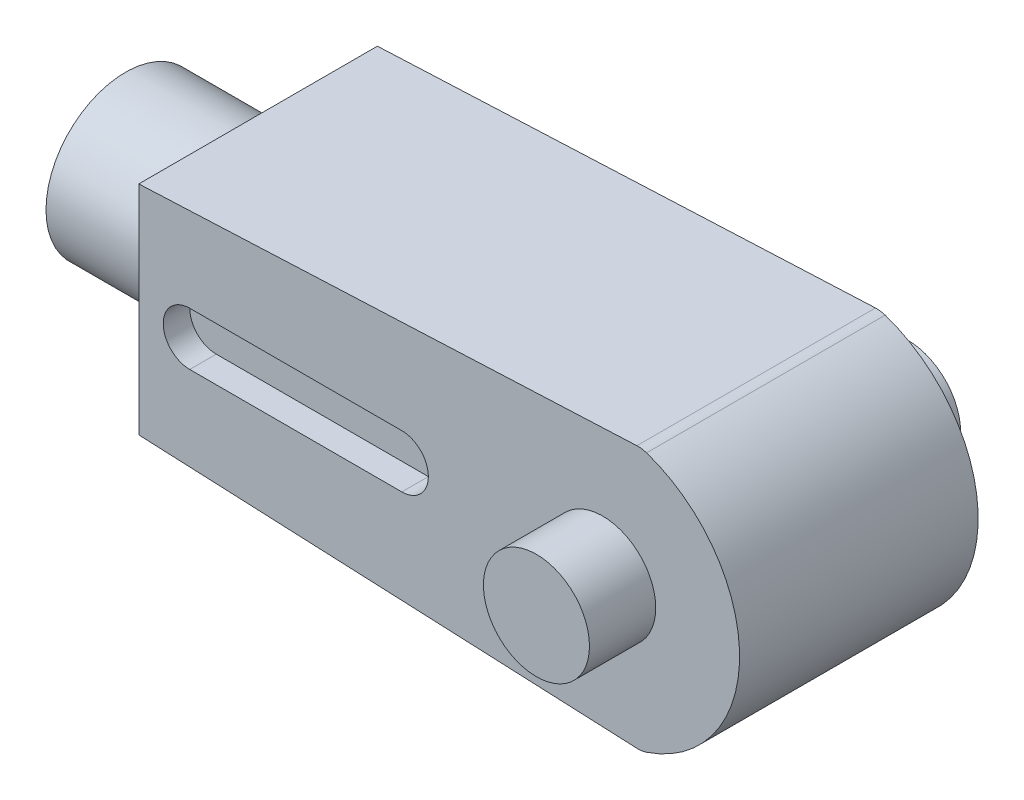
ISO-10303-21;
HEADER;
FILE_DESCRIPTION(('STEP AP214'),'2;1');
FILE_NAME('part.step','',(''),(''),'','','');
FILE_SCHEMA(('AUTOMOTIVE_DESIGN { 1 0 10303 214 1 1 1 1 }'));
ENDSEC;
DATA;
#1=APPLICATION_CONTEXT('core data for automotive mechanical design processes');
#2=APPLICATION_PROTOCOL_DEFINITION('international standard','automotive_design',2000,#1);
#3=PRODUCT_CONTEXT('',#1,'mechanical');
#4=PRODUCT('Part','Part','',(#3));
#5=PRODUCT_RELATED_PRODUCT_CATEGORY('part','',(#4));
#6=PRODUCT_DEFINITION_FORMATION('','',#4);
#7=PRODUCT_DEFINITION_CONTEXT('part definition',#1,'design');
#8=PRODUCT_DEFINITION('design','',#6,#7);
#9=PRODUCT_DEFINITION_SHAPE('','',#8);
#10=(LENGTH_UNIT() NAMED_UNIT(*) SI_UNIT(.MILLI.,.METRE.));
#11=(NAMED_UNIT(*) PLANE_ANGLE_UNIT() SI_UNIT($,.RADIAN.));
#12=(NAMED_UNIT(*) SI_UNIT($,.STERADIAN.) SOLID_ANGLE_UNIT());
#13=UNCERTAINTY_MEASURE_WITH_UNIT(LENGTH_MEASURE(1.E-05),#10,'distance_accuracy_value','');
#14=(GEOMETRIC_REPRESENTATION_CONTEXT(3) GLOBAL_UNCERTAINTY_ASSIGNED_CONTEXT((#13)) GLOBAL_UNIT_ASSIGNED_CONTEXT((#10,
#11,#12)) REPRESENTATION_CONTEXT('',''));
#15=CARTESIAN_POINT('',(0.,0.,0.));
#16=DIRECTION('',(0.,0.,1.));
#17=DIRECTION('',(1.,0.,0.));
#18=AXIS2_PLACEMENT_3D('',#15,#16,#17);
#19=CARTESIAN_POINT('',(107.353868164205,39.4343100022353,-45.));
#20=DIRECTION('',(0.,0.,1.));
#21=DIRECTION('',(1.,0.,0.));
#22=AXIS2_PLACEMENT_3D('',#19,#20,#21);
#23=PLANE('',#22);
#24=CARTESIAN_POINT('',(94.0141342756184,0.,-45.));
#25=DIRECTION('',(0.,0.,1.));
#26=DIRECTION('',(1.,0.,0.));
#27=AXIS2_PLACEMENT_3D('',#24,#25,#26);
#28=CIRCLE('',#27,20.);
#29=CARTESIAN_POINT('',(114.014134275618,0.,-45.));
#30=VERTEX_POINT('',#29);
#31=EDGE_CURVE('E246',#30,#30,#28,.F.);
#32=ORIENTED_EDGE('',*,*,#31,.F.);
#33=EDGE_LOOP('',(#32));
#34=FACE_BOUND('',#33,.T.);
#35=DIRECTION('',(-0.998996389929952,-0.0447907680992794,0.));
#36=VECTOR('',#35,1.);
#37=CARTESIAN_POINT('',(-80.9858657243816,41.,-45.));
#38=LINE('',#37,#36);
#39=CARTESIAN_POINT('',(106.905960483212,49.4242739015349,-45.));
#40=VERTEX_POINT('',#39);
#41=CARTESIAN_POINT('',(-80.9858657243816,41.,-45.));
#42=VERTEX_POINT('',#41);
#43=EDGE_CURVE('E258',#40,#42,#38,.T.);
#44=ORIENTED_EDGE('',*,*,#43,.F.);
#45=CARTESIAN_POINT('',(107.353868164205,39.4343100022353,-45.));
#46=DIRECTION('',(0.,0.,1.));
#47=DIRECTION('',(1.,0.,0.));
#48=AXIS2_PLACEMENT_3D('',#45,#46,#47);
#49=CIRCLE('',#48,10.);
#50=CARTESIAN_POINT('',(110.558264433693,48.9069994064167,-45.));
#51=VERTEX_POINT('',#50);
#52=EDGE_CURVE('E264',#51,#40,#49,.T.);
#53=ORIENTED_EDGE('',*,*,#52,.F.);
#54=CARTESIAN_POINT('',(94.0141342756184,0.,-45.));
#55=DIRECTION('',(0.,0.,1.));
#56=DIRECTION('',(1.,0.,0.));
#57=AXIS2_PLACEMENT_3D('',#54,#55,#56);
#58=CIRCLE('',#57,51.6294764027929);
#59=CARTESIAN_POINT('',(110.558264433693,-48.9069994064166,-45.));
#60=VERTEX_POINT('',#59);
#61=EDGE_CURVE('E292',#60,#51,#58,.T.);
#62=ORIENTED_EDGE('',*,*,#61,.F.);
#63=CARTESIAN_POINT('',(107.353868164205,-39.4343100022353,-45.));
#64=DIRECTION('',(0.,0.,1.));
#65=DIRECTION('',(-1.,0.,0.));
#66=AXIS2_PLACEMENT_3D('',#63,#64,#65);
#67=CIRCLE('',#66,10.);
#68=CARTESIAN_POINT('',(106.905960483212,-49.4242739015348,-45.));
#69=VERTEX_POINT('',#68);
#70=EDGE_CURVE('E289',#69,#60,#67,.T.);
#71=ORIENTED_EDGE('',*,*,#70,.F.);
#72=DIRECTION('',(0.998996389929952,-0.0447907680992793,0.));
#73=VECTOR('',#72,1.);
#74=CARTESIAN_POINT('',(-80.9858657243816,-41.,-45.));
#75=LINE('',#74,#73);
#76=CARTESIAN_POINT('',(-80.9858657243816,-41.,-45.));
#77=VERTEX_POINT('',#76);
#78=EDGE_CURVE('E286',#77,#69,#75,.T.);
#79=ORIENTED_EDGE('',*,*,#78,.F.);
#80=DIRECTION('',(0.,-1.,0.));
#81=VECTOR('',#80,1.);
#82=CARTESIAN_POINT('',(-80.9858657243816,41.,-45.));
#83=LINE('',#82,#81);
#84=EDGE_CURVE('E283',#42,#77,#83,.T.);
#85=ORIENTED_EDGE('',*,*,#84,.F.);
#86=EDGE_LOOP('',(#44,#53,#62,#71,#79,#85));
#87=FACE_BOUND('',#86,.T.);
#88=CARTESIAN_POINT('',(-61.7583058150107,0.,-45.));
#89=DIRECTION('',(0.,0.,1.));
#90=DIRECTION('',(1.,0.,0.));
#91=AXIS2_PLACEMENT_3D('',#88,#89,#90);
#92=CIRCLE('',#91,10.);
#93=CARTESIAN_POINT('',(-61.7583058150107,10.,-45.));
#94=VERTEX_POINT('',#93);
#95=CARTESIAN_POINT('',(-61.7583058150107,-10.,-45.));
#96=VERTEX_POINT('',#95);
#97=EDGE_CURVE('E60',#94,#96,#92,.T.);
#98=ORIENTED_EDGE('',*,*,#97,.T.);
#99=DIRECTION('',(1.,0.,0.));
#100=VECTOR('',#99,1.);
#101=CARTESIAN_POINT('',(-61.7583058150107,-10.,-45.));
#102=LINE('',#101,#100);
#103=CARTESIAN_POINT('',(18.2416941849893,-10.,-45.));
#104=VERTEX_POINT('',#103);
#105=EDGE_CURVE('E169',#96,#104,#102,.T.);
#106=ORIENTED_EDGE('',*,*,#105,.T.);
#107=CARTESIAN_POINT('',(18.2416941849893,0.,-45.));
#108=DIRECTION('',(0.,0.,1.));
#109=DIRECTION('',(1.,0.,0.));
#110=AXIS2_PLACEMENT_3D('',#107,#108,#109);
#111=CIRCLE('',#110,10.);
#112=CARTESIAN_POINT('',(18.2416941849893,10.,-45.));
#113=VERTEX_POINT('',#112);
#114=EDGE_CURVE('E173',#104,#113,#111,.T.);
#115=ORIENTED_EDGE('',*,*,#114,.T.);
#116=DIRECTION('',(-1.,0.,0.));
#117=VECTOR('',#116,1.);
#118=CARTESIAN_POINT('',(-61.7583058150107,10.,-45.));
#119=LINE('',#118,#117);
#120=EDGE_CURVE('E182',#113,#94,#119,.T.);
#121=ORIENTED_EDGE('',*,*,#120,.T.);
#122=EDGE_LOOP('',(#98,#106,#115,#121));
#123=FACE_BOUND('',#122,.T.);
#124=ADVANCED_FACE('F43',(#34,#87,#123),#23,.F.);
#125=CARTESIAN_POINT('',(107.353868164205,39.4343100022353,45.));
#126=DIRECTION('',(0.,0.,1.));
#127=DIRECTION('',(1.,0.,0.));
#128=AXIS2_PLACEMENT_3D('',#125,#126,#127);
#129=PLANE('',#128);
#130=CARTESIAN_POINT('',(-61.7583058150107,0.,45.));
#131=DIRECTION('',(0.,0.,1.));
#132=DIRECTION('',(1.,0.,0.));
#133=AXIS2_PLACEMENT_3D('',#130,#131,#132);
#134=CIRCLE('',#133,10.);
#135=CARTESIAN_POINT('',(-61.7583058150107,10.,45.));
#136=VERTEX_POINT('',#135);
#137=CARTESIAN_POINT('',(-61.7583058150107,-10.,45.));
#138=VERTEX_POINT('',#137);
#139=EDGE_CURVE('E68',#136,#138,#134,.T.);
#140=ORIENTED_EDGE('',*,*,#139,.F.);
#141=DIRECTION('',(-1.,0.,0.));
#142=VECTOR('',#141,1.);
#143=CARTESIAN_POINT('',(-61.7583058150107,10.,45.));
#144=LINE('',#143,#142);
#145=CARTESIAN_POINT('',(18.2416941849893,10.,45.));
#146=VERTEX_POINT('',#145);
#147=EDGE_CURVE('E201',#146,#136,#144,.T.);
#148=ORIENTED_EDGE('',*,*,#147,.F.);
#149=CARTESIAN_POINT('',(18.2416941849893,0.,45.));
#150=DIRECTION('',(0.,0.,1.));
#151=DIRECTION('',(1.,0.,0.));
#152=AXIS2_PLACEMENT_3D('',#149,#150,#151);
#153=CIRCLE('',#152,10.);
#154=CARTESIAN_POINT('',(18.2416941849893,-10.,45.));
#155=VERTEX_POINT('',#154);
#156=EDGE_CURVE('E220',#155,#146,#153,.T.);
#157=ORIENTED_EDGE('',*,*,#156,.F.);
#158=DIRECTION('',(1.,0.,0.));
#159=VECTOR('',#158,1.);
#160=CARTESIAN_POINT('',(-61.7583058150107,-10.,45.));
#161=LINE('',#160,#159);
#162=EDGE_CURVE('E216',#138,#155,#161,.T.);
#163=ORIENTED_EDGE('',*,*,#162,.F.);
#164=EDGE_LOOP('',(#140,#148,#157,#163));
#165=FACE_BOUND('',#164,.T.);
#166=DIRECTION('',(-0.998996389929952,-0.0447907680992794,0.));
#167=VECTOR('',#166,1.);
#168=CARTESIAN_POINT('',(-80.9858657243816,41.,45.));
#169=LINE('',#168,#167);
#170=CARTESIAN_POINT('',(106.905960483212,49.4242739015349,45.));
#171=VERTEX_POINT('',#170);
#172=CARTESIAN_POINT('',(-80.9858657243816,41.,45.));
#173=VERTEX_POINT('',#172);
#174=EDGE_CURVE('E259',#171,#173,#169,.T.);
#175=ORIENTED_EDGE('',*,*,#174,.T.);
#176=DIRECTION('',(0.,-1.,0.));
#177=VECTOR('',#176,1.);
#178=CARTESIAN_POINT('',(-80.9858657243816,41.,45.));
#179=LINE('',#178,#177);
#180=CARTESIAN_POINT('',(-80.9858657243816,-41.,45.));
#181=VERTEX_POINT('',#180);
#182=EDGE_CURVE('E263',#173,#181,#179,.T.);
#183=ORIENTED_EDGE('',*,*,#182,.T.);
#184=DIRECTION('',(0.998996389929952,-0.0447907680992793,0.));
#185=VECTOR('',#184,1.);
#186=CARTESIAN_POINT('',(-80.9858657243816,-41.,45.));
#187=LINE('',#186,#185);
#188=CARTESIAN_POINT('',(106.905960483212,-49.4242739015348,45.));
#189=VERTEX_POINT('',#188);
#190=EDGE_CURVE('E267',#181,#189,#187,.T.);
#191=ORIENTED_EDGE('',*,*,#190,.T.);
#192=CARTESIAN_POINT('',(107.353868164205,-39.4343100022353,45.));
#193=DIRECTION('',(0.,0.,1.));
#194=DIRECTION('',(-1.,0.,0.));
#195=AXIS2_PLACEMENT_3D('',#192,#193,#194);
#196=CIRCLE('',#195,10.);
#197=CARTESIAN_POINT('',(110.558264433693,-48.9069994064166,45.));
#198=VERTEX_POINT('',#197);
#199=EDGE_CURVE('E270',#189,#198,#196,.T.);
#200=ORIENTED_EDGE('',*,*,#199,.T.);
#201=CARTESIAN_POINT('',(94.0141342756184,0.,45.));
#202=DIRECTION('',(0.,0.,1.));
#203=DIRECTION('',(1.,0.,0.));
#204=AXIS2_PLACEMENT_3D('',#201,#202,#203);
#205=CIRCLE('',#204,51.6294764027929);
#206=CARTESIAN_POINT('',(110.558264433693,48.9069994064167,45.));
#207=VERTEX_POINT('',#206);
#208=EDGE_CURVE('E273',#198,#207,#205,.T.);
#209=ORIENTED_EDGE('',*,*,#208,.T.);
#210=CARTESIAN_POINT('',(107.353868164205,39.4343100022353,45.));
#211=DIRECTION('',(0.,0.,1.));
#212=DIRECTION('',(1.,0.,0.));
#213=AXIS2_PLACEMENT_3D('',#210,#211,#212);
#214=CIRCLE('',#213,10.);
#215=EDGE_CURVE('E276',#207,#171,#214,.T.);
#216=ORIENTED_EDGE('',*,*,#215,.T.);
#217=EDGE_LOOP('',(#175,#183,#191,#200,#209,#216));
#218=FACE_BOUND('',#217,.T.);
#219=CARTESIAN_POINT('',(94.0141342756184,0.,45.));
#220=DIRECTION('',(0.,0.,1.));
#221=DIRECTION('',(1.,0.,0.));
#222=AXIS2_PLACEMENT_3D('',#219,#220,#221);
#223=CIRCLE('',#222,20.);
#224=CARTESIAN_POINT('',(114.014134275618,0.,45.));
#225=VERTEX_POINT('',#224);
#226=EDGE_CURVE('E253',#225,#225,#223,.T.);
#227=ORIENTED_EDGE('',*,*,#226,.F.);
#228=EDGE_LOOP('',(#227));
#229=FACE_BOUND('',#228,.T.);
#230=ADVANCED_FACE('F340',(#165,#218,#229),#129,.T.);
#231=CARTESIAN_POINT('',(-80.9858657243816,41.,45.));
#232=DIRECTION('',(0.0447907680992794,-0.998996389929952,0.));
#233=DIRECTION('',(0.998996389929952,0.0447907680992794,0.));
#234=AXIS2_PLACEMENT_3D('',#231,#232,#233);
#235=PLANE('',#234);
#236=ORIENTED_EDGE('',*,*,#43,.T.);
#237=DIRECTION('',(0.,0.,-1.));
#238=VECTOR('',#237,1.);
#239=CARTESIAN_POINT('',(-80.9858657243816,41.,45.));
#240=LINE('',#239,#238);
#241=EDGE_CURVE('E47',#173,#42,#240,.T.);
#242=ORIENTED_EDGE('',*,*,#241,.F.);
#243=ORIENTED_EDGE('',*,*,#174,.F.);
#244=DIRECTION('',(0.,0.,-1.));
#245=VECTOR('',#244,1.);
#246=CARTESIAN_POINT('',(106.905960483212,49.4242739015349,45.));
#247=LINE('',#246,#245);
#248=EDGE_CURVE('E279',#171,#40,#247,.T.);
#249=ORIENTED_EDGE('',*,*,#248,.T.);
#250=EDGE_LOOP('',(#236,#242,#243,#249));
#251=FACE_BOUND('',#250,.T.);
#252=ADVANCED_FACE('F45',(#251),#235,.F.);
#253=CARTESIAN_POINT('',(-80.9858657243816,41.,45.));
#254=DIRECTION('',(1.,0.,0.));
#255=DIRECTION('',(0.,0.,-1.));
#256=AXIS2_PLACEMENT_3D('',#253,#254,#255);
#257=PLANE('',#256);
#258=CARTESIAN_POINT('',(-80.9858657243816,0.,0.));
#259=DIRECTION('',(-1.,0.,0.));
#260=DIRECTION('',(0.,0.,1.));
#261=AXIS2_PLACEMENT_3D('',#258,#259,#260);
#262=CIRCLE('',#261,30.);
#263=CARTESIAN_POINT('',(-80.9858657243816,0.,30.));
#264=VERTEX_POINT('',#263);
#265=EDGE_CURVE('E11',#264,#264,#262,.T.);
#266=ORIENTED_EDGE('',*,*,#265,.F.);
#267=EDGE_LOOP('',(#266));
#268=FACE_BOUND('',#267,.T.);
#269=ORIENTED_EDGE('',*,*,#84,.T.);
#270=DIRECTION('',(0.,0.,-1.));
#271=VECTOR('',#270,1.);
#272=CARTESIAN_POINT('',(-80.9858657243816,-41.,45.));
#273=LINE('',#272,#271);
#274=EDGE_CURVE('E311',#181,#77,#273,.T.);
#275=ORIENTED_EDGE('',*,*,#274,.F.);
#276=ORIENTED_EDGE('',*,*,#182,.F.);
#277=ORIENTED_EDGE('',*,*,#241,.T.);
#278=EDGE_LOOP('',(#269,#275,#276,#277));
#279=FACE_BOUND('',#278,.T.);
#280=ADVANCED_FACE('F322',(#268,#279),#257,.F.);
#281=CARTESIAN_POINT('',(-80.9858657243816,-41.,45.));
#282=DIRECTION('',(0.0447907680992793,0.998996389929952,0.));
#283=DIRECTION('',(-0.998996389929952,0.0447907680992793,0.));
#284=AXIS2_PLACEMENT_3D('',#281,#282,#283);
#285=PLANE('',#284);
#286=ORIENTED_EDGE('',*,*,#78,.T.);
#287=DIRECTION('',(0.,0.,-1.));
#288=VECTOR('',#287,1.);
#289=CARTESIAN_POINT('',(106.905960483212,-49.4242739015348,45.));
#290=LINE('',#289,#288);
#291=EDGE_CURVE('E308',#189,#69,#290,.T.);
#292=ORIENTED_EDGE('',*,*,#291,.F.);
#293=ORIENTED_EDGE('',*,*,#190,.F.);
#294=ORIENTED_EDGE('',*,*,#274,.T.);
#295=EDGE_LOOP('',(#286,#292,#293,#294));
#296=FACE_BOUND('',#295,.T.);
#297=ADVANCED_FACE('F333',(#296),#285,.F.);
#298=CARTESIAN_POINT('',(107.353868164205,-39.4343100022353,45.));
#299=DIRECTION('',(0.,0.,-1.));
#300=DIRECTION('',(-1.,0.,0.));
#301=AXIS2_PLACEMENT_3D('',#298,#299,#300);
#302=CYLINDRICAL_SURFACE('',#301,10.);
#303=ORIENTED_EDGE('',*,*,#70,.T.);
#304=DIRECTION('',(0.,0.,-1.));
#305=VECTOR('',#304,1.);
#306=CARTESIAN_POINT('',(110.558264433693,-48.9069994064166,45.));
#307=LINE('',#306,#305);
#308=EDGE_CURVE('E304',#198,#60,#307,.T.);
#309=ORIENTED_EDGE('',*,*,#308,.F.);
#310=ORIENTED_EDGE('',*,*,#199,.F.);
#311=ORIENTED_EDGE('',*,*,#291,.T.);
#312=EDGE_LOOP('',(#303,#309,#310,#311));
#313=FACE_BOUND('',#312,.T.);
#314=ADVANCED_FACE('F336',(#313),#302,.T.);
#315=CARTESIAN_POINT('',(94.0141342756184,0.,45.));
#316=DIRECTION('',(0.,0.,-1.));
#317=DIRECTION('',(-1.,0.,0.));
#318=AXIS2_PLACEMENT_3D('',#315,#316,#317);
#319=CYLINDRICAL_SURFACE('',#318,51.6294764027929);
#320=ORIENTED_EDGE('',*,*,#61,.T.);
#321=DIRECTION('',(0.,0.,-1.));
#322=VECTOR('',#321,1.);
#323=CARTESIAN_POINT('',(110.558264433693,48.9069994064167,45.));
#324=LINE('',#323,#322);
#325=EDGE_CURVE('E300',#207,#51,#324,.T.);
#326=ORIENTED_EDGE('',*,*,#325,.F.);
#327=ORIENTED_EDGE('',*,*,#208,.F.);
#328=ORIENTED_EDGE('',*,*,#308,.T.);
#329=EDGE_LOOP('',(#320,#326,#327,#328));
#330=FACE_BOUND('',#329,.T.);
#331=ADVANCED_FACE('F347',(#330),#319,.T.);
#332=CARTESIAN_POINT('',(107.353868164205,39.4343100022353,45.));
#333=DIRECTION('',(0.,0.,-1.));
#334=DIRECTION('',(-1.,0.,0.));
#335=AXIS2_PLACEMENT_3D('',#332,#333,#334);
#336=CYLINDRICAL_SURFACE('',#335,10.);
#337=ORIENTED_EDGE('',*,*,#52,.T.);
#338=ORIENTED_EDGE('',*,*,#248,.F.);
#339=ORIENTED_EDGE('',*,*,#215,.F.);
#340=ORIENTED_EDGE('',*,*,#325,.T.);
#341=EDGE_LOOP('',(#337,#338,#339,#340));
#342=FACE_BOUND('',#341,.T.);
#343=ADVANCED_FACE('F345',(#342),#336,.T.);
#344=CARTESIAN_POINT('',(-130.985865724382,0.,0.));
#345=DIRECTION('',(1.,0.,0.));
#346=DIRECTION('',(0.,0.,-1.));
#347=AXIS2_PLACEMENT_3D('',#344,#345,#346);
#348=CYLINDRICAL_SURFACE('',#347,30.);
#349=CARTESIAN_POINT('',(-130.985865724382,0.,0.));
#350=DIRECTION('',(-1.,0.,0.));
#351=DIRECTION('',(0.,0.,1.));
#352=AXIS2_PLACEMENT_3D('',#349,#350,#351);
#353=CIRCLE('',#352,30.);
#354=CARTESIAN_POINT('',(-130.985865724382,0.,30.));
#355=VERTEX_POINT('',#354);
#356=EDGE_CURVE('E250',#355,#355,#353,.T.);
#357=ORIENTED_EDGE('',*,*,#356,.F.);
#358=EDGE_LOOP('',(#357));
#359=FACE_BOUND('',#358,.T.);
#360=ORIENTED_EDGE('',*,*,#265,.T.);
#361=EDGE_LOOP('',(#360));
#362=FACE_BOUND('',#361,.T.);
#363=ADVANCED_FACE('F354',(#359,#362),#348,.T.);
#364=CARTESIAN_POINT('',(-130.985865724382,0.,0.));
#365=DIRECTION('',(-1.,0.,0.));
#366=DIRECTION('',(0.,0.,1.));
#367=AXIS2_PLACEMENT_3D('',#364,#365,#366);
#368=PLANE('',#367);
#369=ORIENTED_EDGE('',*,*,#356,.T.);
#370=EDGE_LOOP('',(#369));
#371=FACE_BOUND('',#370,.T.);
#372=ADVANCED_FACE('F369',(#371),#368,.T.);
#373=CARTESIAN_POINT('',(94.0141342756184,0.,-70.));
#374=DIRECTION('',(0.,0.,1.));
#375=DIRECTION('',(1.,0.,0.));
#376=AXIS2_PLACEMENT_3D('',#373,#374,#375);
#377=PLANE('',#376);
#378=CARTESIAN_POINT('',(94.0141342756184,0.,-70.));
#379=DIRECTION('',(0.,0.,1.));
#380=DIRECTION('',(1.,0.,0.));
#381=AXIS2_PLACEMENT_3D('',#378,#379,#380);
#382=CIRCLE('',#381,20.);
#383=CARTESIAN_POINT('',(114.014134275618,0.,-70.));
#384=VERTEX_POINT('',#383);
#385=EDGE_CURVE('E230',#384,#384,#382,.T.);
#386=ORIENTED_EDGE('',*,*,#385,.F.);
#387=EDGE_LOOP('',(#386));
#388=FACE_BOUND('',#387,.T.);
#389=ADVANCED_FACE('F373',(#388),#377,.F.);
#390=CARTESIAN_POINT('',(94.0141342756184,0.,70.));
#391=DIRECTION('',(0.,0.,-1.));
#392=DIRECTION('',(-1.,0.,0.));
#393=AXIS2_PLACEMENT_3D('',#390,#391,#392);
#394=CYLINDRICAL_SURFACE('',#393,20.);
#395=ORIENTED_EDGE('',*,*,#385,.T.);
#396=EDGE_LOOP('',(#395));
#397=FACE_BOUND('',#396,.T.);
#398=ORIENTED_EDGE('',*,*,#31,.T.);
#399=EDGE_LOOP('',(#398));
#400=FACE_BOUND('',#399,.T.);
#401=ADVANCED_FACE('F379',(#397,#400),#394,.T.);
#402=ORIENTED_EDGE('',*,*,#226,.T.);
#403=EDGE_LOOP('',(#402));
#404=FACE_BOUND('',#403,.T.);
#405=CARTESIAN_POINT('',(94.0141342756184,0.,70.));
#406=DIRECTION('',(0.,0.,1.));
#407=DIRECTION('',(1.,0.,0.));
#408=AXIS2_PLACEMENT_3D('',#405,#406,#407);
#409=CIRCLE('',#408,20.);
#410=CARTESIAN_POINT('',(114.014134275618,0.,70.));
#411=VERTEX_POINT('',#410);
#412=EDGE_CURVE('E242',#411,#411,#409,.T.);
#413=ORIENTED_EDGE('',*,*,#412,.F.);
#414=EDGE_LOOP('',(#413));
#415=FACE_BOUND('',#414,.T.);
#416=ADVANCED_FACE('F375',(#404,#415),#394,.T.);
#417=CARTESIAN_POINT('',(94.0141342756184,0.,70.));
#418=DIRECTION('',(0.,0.,1.));
#419=DIRECTION('',(1.,0.,0.));
#420=AXIS2_PLACEMENT_3D('',#417,#418,#419);
#421=PLANE('',#420);
#422=ORIENTED_EDGE('',*,*,#412,.T.);
#423=EDGE_LOOP('',(#422));
#424=FACE_BOUND('',#423,.T.);
#425=ADVANCED_FACE('F378',(#424),#421,.T.);
#426=CARTESIAN_POINT('',(-61.7583058150107,0.,35.));
#427=DIRECTION('',(0.,0.,1.));
#428=DIRECTION('',(1.,0.,0.));
#429=AXIS2_PLACEMENT_3D('',#426,#427,#428);
#430=CYLINDRICAL_SURFACE('',#429,10.);
#431=ORIENTED_EDGE('',*,*,#139,.T.);
#432=DIRECTION('',(0.,0.,1.));
#433=VECTOR('',#432,1.);
#434=CARTESIAN_POINT('',(-61.7583058150107,-10.,35.));
#435=LINE('',#434,#433);
#436=CARTESIAN_POINT('',(-61.7583058150107,-10.,35.));
#437=VERTEX_POINT('',#436);
#438=EDGE_CURVE('E213',#437,#138,#435,.T.);
#439=ORIENTED_EDGE('',*,*,#438,.F.);
#440=CARTESIAN_POINT('',(-61.7583058150107,0.,35.));
#441=DIRECTION('',(0.,0.,1.));
#442=DIRECTION('',(1.,0.,0.));
#443=AXIS2_PLACEMENT_3D('',#440,#441,#442);
#444=CIRCLE('',#443,10.);
#445=CARTESIAN_POINT('',(-61.7583058150107,10.,35.));
#446=VERTEX_POINT('',#445);
#447=EDGE_CURVE('E196',#446,#437,#444,.T.);
#448=ORIENTED_EDGE('',*,*,#447,.F.);
#449=DIRECTION('',(0.,0.,1.));
#450=VECTOR('',#449,1.);
#451=CARTESIAN_POINT('',(-61.7583058150107,10.,35.));
#452=LINE('',#451,#450);
#453=EDGE_CURVE('E227',#446,#136,#452,.T.);
#454=ORIENTED_EDGE('',*,*,#453,.T.);
#455=EDGE_LOOP('',(#431,#439,#448,#454));
#456=FACE_BOUND('',#455,.T.);
#457=ADVANCED_FACE('F383',(#456),#430,.F.);
#458=CARTESIAN_POINT('',(-61.7583058150107,10.,35.));
#459=DIRECTION('',(0.,1.,0.));
#460=DIRECTION('',(0.,0.,1.));
#461=AXIS2_PLACEMENT_3D('',#458,#459,#460);
#462=PLANE('',#461);
#463=ORIENTED_EDGE('',*,*,#147,.T.);
#464=ORIENTED_EDGE('',*,*,#453,.F.);
#465=DIRECTION('',(-1.,0.,0.));
#466=VECTOR('',#465,1.);
#467=CARTESIAN_POINT('',(-61.7583058150107,10.,35.));
#468=LINE('',#467,#466);
#469=CARTESIAN_POINT('',(18.2416941849893,10.,35.));
#470=VERTEX_POINT('',#469);
#471=EDGE_CURVE('E209',#470,#446,#468,.T.);
#472=ORIENTED_EDGE('',*,*,#471,.F.);
#473=DIRECTION('',(0.,0.,1.));
#474=VECTOR('',#473,1.);
#475=CARTESIAN_POINT('',(18.2416941849893,10.,35.));
#476=LINE('',#475,#474);
#477=EDGE_CURVE('E231',#470,#146,#476,.T.);
#478=ORIENTED_EDGE('',*,*,#477,.T.);
#479=EDGE_LOOP('',(#463,#464,#472,#478));
#480=FACE_BOUND('',#479,.T.);
#481=ADVANCED_FACE('F390',(#480),#462,.F.);
#482=CARTESIAN_POINT('',(18.2416941849893,0.,35.));
#483=DIRECTION('',(0.,0.,1.));
#484=DIRECTION('',(1.,0.,0.));
#485=AXIS2_PLACEMENT_3D('',#482,#483,#484);
#486=CYLINDRICAL_SURFACE('',#485,10.);
#487=ORIENTED_EDGE('',*,*,#156,.T.);
#488=ORIENTED_EDGE('',*,*,#477,.F.);
#489=CARTESIAN_POINT('',(18.2416941849893,0.,35.));
#490=DIRECTION('',(0.,0.,1.));
#491=DIRECTION('',(1.,0.,0.));
#492=AXIS2_PLACEMENT_3D('',#489,#490,#491);
#493=CIRCLE('',#492,10.);
#494=CARTESIAN_POINT('',(18.2416941849893,-10.,35.));
#495=VERTEX_POINT('',#494);
#496=EDGE_CURVE('E205',#495,#470,#493,.T.);
#497=ORIENTED_EDGE('',*,*,#496,.F.);
#498=DIRECTION('',(0.,0.,1.));
#499=VECTOR('',#498,1.);
#500=CARTESIAN_POINT('',(18.2416941849893,-10.,35.));
#501=LINE('',#500,#499);
#502=EDGE_CURVE('E234',#495,#155,#501,.T.);
#503=ORIENTED_EDGE('',*,*,#502,.T.);
#504=EDGE_LOOP('',(#487,#488,#497,#503));
#505=FACE_BOUND('',#504,.T.);
#506=ADVANCED_FACE('F395',(#505),#486,.F.);
#507=CARTESIAN_POINT('',(-61.7583058150107,-10.,35.));
#508=DIRECTION('',(0.,-1.,0.));
#509=DIRECTION('',(0.,0.,-1.));
#510=AXIS2_PLACEMENT_3D('',#507,#508,#509);
#511=PLANE('',#510);
#512=ORIENTED_EDGE('',*,*,#162,.T.);
#513=ORIENTED_EDGE('',*,*,#502,.F.);
#514=DIRECTION('',(1.,0.,0.));
#515=VECTOR('',#514,1.);
#516=CARTESIAN_POINT('',(-61.7583058150107,-10.,35.));
#517=LINE('',#516,#515);
#518=EDGE_CURVE('E200',#437,#495,#517,.T.);
#519=ORIENTED_EDGE('',*,*,#518,.F.);
#520=ORIENTED_EDGE('',*,*,#438,.T.);
#521=EDGE_LOOP('',(#512,#513,#519,#520));
#522=FACE_BOUND('',#521,.T.);
#523=ADVANCED_FACE('F391',(#522),#511,.F.);
#524=CARTESIAN_POINT('',(-61.7583058150107,0.,35.));
#525=DIRECTION('',(0.,0.,1.));
#526=DIRECTION('',(1.,0.,0.));
#527=AXIS2_PLACEMENT_3D('',#524,#525,#526);
#528=PLANE('',#527);
#529=ORIENTED_EDGE('',*,*,#447,.T.);
#530=ORIENTED_EDGE('',*,*,#518,.T.);
#531=ORIENTED_EDGE('',*,*,#496,.T.);
#532=ORIENTED_EDGE('',*,*,#471,.T.);
#533=EDGE_LOOP('',(#529,#530,#531,#532));
#534=FACE_BOUND('',#533,.T.);
#535=ADVANCED_FACE('F394',(#534),#528,.T.);
#536=CARTESIAN_POINT('',(-61.7583058150107,0.,-35.));
#537=DIRECTION('',(0.,0.,-1.));
#538=DIRECTION('',(-1.,0.,0.));
#539=AXIS2_PLACEMENT_3D('',#536,#537,#538);
#540=CYLINDRICAL_SURFACE('',#539,10.);
#541=ORIENTED_EDGE('',*,*,#97,.F.);
#542=DIRECTION('',(0.,0.,-1.));
#543=VECTOR('',#542,1.);
#544=CARTESIAN_POINT('',(-61.7583058150107,10.,-35.));
#545=LINE('',#544,#543);
#546=CARTESIAN_POINT('',(-61.7583058150107,10.,-35.));
#547=VERTEX_POINT('',#546);
#548=EDGE_CURVE('E151',#547,#94,#545,.T.);
#549=ORIENTED_EDGE('',*,*,#548,.F.);
#550=CARTESIAN_POINT('',(-61.7583058150107,0.,-35.));
#551=DIRECTION('',(0.,0.,1.));
#552=DIRECTION('',(1.,0.,0.));
#553=AXIS2_PLACEMENT_3D('',#550,#551,#552);
#554=CIRCLE('',#553,10.);
#555=CARTESIAN_POINT('',(-61.7583058150107,-10.,-35.));
#556=VERTEX_POINT('',#555);
#557=EDGE_CURVE('E159',#547,#556,#554,.T.);
#558=ORIENTED_EDGE('',*,*,#557,.T.);
#559=DIRECTION('',(0.,0.,-1.));
#560=VECTOR('',#559,1.);
#561=CARTESIAN_POINT('',(-61.7583058150107,-10.,-35.));
#562=LINE('',#561,#560);
#563=EDGE_CURVE('E188',#556,#96,#562,.T.);
#564=ORIENTED_EDGE('',*,*,#563,.T.);
#565=EDGE_LOOP('',(#541,#549,#558,#564));
#566=FACE_BOUND('',#565,.T.);
#567=ADVANCED_FACE('F162',(#566),#540,.F.);
#568=CARTESIAN_POINT('',(-61.7583058150107,-10.,-35.));
#569=DIRECTION('',(0.,1.,0.));
#570=DIRECTION('',(0.,0.,1.));
#571=AXIS2_PLACEMENT_3D('',#568,#569,#570);
#572=PLANE('',#571);
#573=ORIENTED_EDGE('',*,*,#105,.F.);
#574=ORIENTED_EDGE('',*,*,#563,.F.);
#575=DIRECTION('',(1.,0.,0.));
#576=VECTOR('',#575,1.);
#577=CARTESIAN_POINT('',(-61.7583058150107,-10.,-35.));
#578=LINE('',#577,#576);
#579=CARTESIAN_POINT('',(18.2416941849893,-10.,-35.));
#580=VERTEX_POINT('',#579);
#581=EDGE_CURVE('E165',#556,#580,#578,.T.);
#582=ORIENTED_EDGE('',*,*,#581,.T.);
#583=DIRECTION('',(0.,0.,-1.));
#584=VECTOR('',#583,1.);
#585=CARTESIAN_POINT('',(18.2416941849893,-10.,-35.));
#586=LINE('',#585,#584);
#587=EDGE_CURVE('E191',#580,#104,#586,.T.);
#588=ORIENTED_EDGE('',*,*,#587,.T.);
#589=EDGE_LOOP('',(#573,#574,#582,#588));
#590=FACE_BOUND('',#589,.T.);
#591=ADVANCED_FACE('F408',(#590),#572,.T.);
#592=CARTESIAN_POINT('',(18.2416941849893,0.,-35.));
#593=DIRECTION('',(0.,0.,-1.));
#594=DIRECTION('',(-1.,0.,0.));
#595=AXIS2_PLACEMENT_3D('',#592,#593,#594);
#596=CYLINDRICAL_SURFACE('',#595,10.);
#597=ORIENTED_EDGE('',*,*,#114,.F.);
#598=ORIENTED_EDGE('',*,*,#587,.F.);
#599=CARTESIAN_POINT('',(18.2416941849893,0.,-35.));
#600=DIRECTION('',(0.,0.,1.));
#601=DIRECTION('',(1.,0.,0.));
#602=AXIS2_PLACEMENT_3D('',#599,#600,#601);
#603=CIRCLE('',#602,10.);
#604=CARTESIAN_POINT('',(18.2416941849893,10.,-35.));
#605=VERTEX_POINT('',#604);
#606=EDGE_CURVE('E158',#580,#605,#603,.T.);
#607=ORIENTED_EDGE('',*,*,#606,.T.);
#608=DIRECTION('',(0.,0.,-1.));
#609=VECTOR('',#608,1.);
#610=CARTESIAN_POINT('',(18.2416941849893,10.,-35.));
#611=LINE('',#610,#609);
#612=EDGE_CURVE('E153',#605,#113,#611,.T.);
#613=ORIENTED_EDGE('',*,*,#612,.T.);
#614=EDGE_LOOP('',(#597,#598,#607,#613));
#615=FACE_BOUND('',#614,.T.);
#616=ADVANCED_FACE('F411',(#615),#596,.F.);
#617=CARTESIAN_POINT('',(-61.7583058150107,10.,-35.));
#618=DIRECTION('',(0.,-1.,0.));
#619=DIRECTION('',(0.,0.,-1.));
#620=AXIS2_PLACEMENT_3D('',#617,#618,#619);
#621=PLANE('',#620);
#622=ORIENTED_EDGE('',*,*,#120,.F.);
#623=ORIENTED_EDGE('',*,*,#612,.F.);
#624=DIRECTION('',(-1.,0.,0.));
#625=VECTOR('',#624,1.);
#626=CARTESIAN_POINT('',(-61.7583058150107,10.,-35.));
#627=LINE('',#626,#625);
#628=EDGE_CURVE('E148',#605,#547,#627,.T.);
#629=ORIENTED_EDGE('',*,*,#628,.T.);
#630=ORIENTED_EDGE('',*,*,#548,.T.);
#631=EDGE_LOOP('',(#622,#623,#629,#630));
#632=FACE_BOUND('',#631,.T.);
#633=ADVANCED_FACE('F150',(#632),#621,.T.);
#634=CARTESIAN_POINT('',(-61.7583058150107,0.,-35.));
#635=DIRECTION('',(0.,0.,-1.));
#636=DIRECTION('',(1.,0.,0.));
#637=AXIS2_PLACEMENT_3D('',#634,#635,#636);
#638=PLANE('',#637);
#639=ORIENTED_EDGE('',*,*,#557,.F.);
#640=ORIENTED_EDGE('',*,*,#628,.F.);
#641=ORIENTED_EDGE('',*,*,#606,.F.);
#642=ORIENTED_EDGE('',*,*,#581,.F.);
#643=EDGE_LOOP('',(#639,#640,#641,#642));
#644=FACE_BOUND('',#643,.T.);
#645=ADVANCED_FACE('F167',(#644),#638,.T.);
#646=CLOSED_SHELL('',(#124,#230,#252,#280,#297,#314,#331,#343,#363,#372,#389,#401,#416,#425,
#457,#481,#506,#523,#535,#567,#591,#616,#633,#645));
#647=MANIFOLD_SOLID_BREP('B2',#646);
#648=ADVANCED_BREP_SHAPE_REPRESENTATION('',(#18,#647),#14);
#649=SHAPE_DEFINITION_REPRESENTATION(#9,#648);
ENDSEC;
END-ISO-10303-21;
